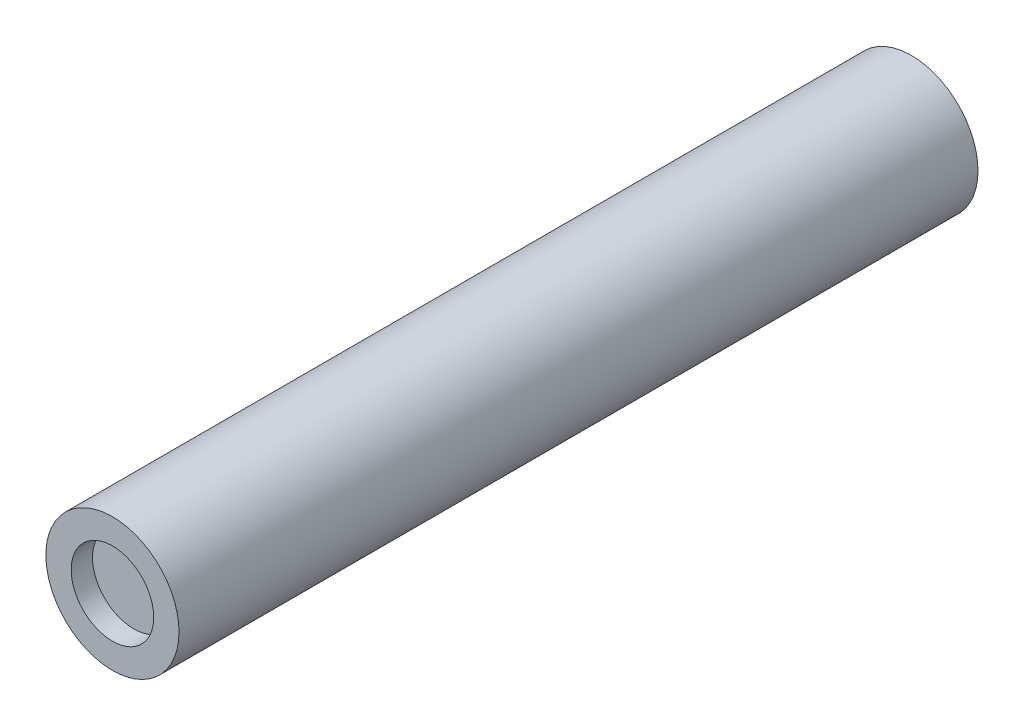
ISO-10303-21;
HEADER;
FILE_DESCRIPTION(('STEP AP214'),'2;1');
FILE_NAME('part.step','',(''),(''),'','','');
FILE_SCHEMA(('AUTOMOTIVE_DESIGN { 1 0 10303 214 1 1 1 1 }'));
ENDSEC;
DATA;
#1=APPLICATION_CONTEXT('core data for automotive mechanical design processes');
#2=APPLICATION_PROTOCOL_DEFINITION('international standard','automotive_design',2000,#1);
#3=PRODUCT_CONTEXT('',#1,'mechanical');
#4=PRODUCT('Part','Part','',(#3));
#5=PRODUCT_RELATED_PRODUCT_CATEGORY('part','',(#4));
#6=PRODUCT_DEFINITION_FORMATION('','',#4);
#7=PRODUCT_DEFINITION_CONTEXT('part definition',#1,'design');
#8=PRODUCT_DEFINITION('design','',#6,#7);
#9=PRODUCT_DEFINITION_SHAPE('','',#8);
#10=(LENGTH_UNIT() NAMED_UNIT(*) SI_UNIT(.MILLI.,.METRE.));
#11=(NAMED_UNIT(*) PLANE_ANGLE_UNIT() SI_UNIT($,.RADIAN.));
#12=(NAMED_UNIT(*) SI_UNIT($,.STERADIAN.) SOLID_ANGLE_UNIT());
#13=UNCERTAINTY_MEASURE_WITH_UNIT(LENGTH_MEASURE(1.E-05),#10,'distance_accuracy_value','');
#14=(GEOMETRIC_REPRESENTATION_CONTEXT(3) GLOBAL_UNCERTAINTY_ASSIGNED_CONTEXT((#13)) GLOBAL_UNIT_ASSIGNED_CONTEXT((#10,
#11,#12)) REPRESENTATION_CONTEXT('',''));
#15=CARTESIAN_POINT('',(0.,0.,0.));
#16=DIRECTION('',(0.,0.,1.));
#17=DIRECTION('',(1.,0.,0.));
#18=AXIS2_PLACEMENT_3D('',#15,#16,#17);
#19=CARTESIAN_POINT('',(-47.0621091602806,23.3146449704142,60.));
#20=DIRECTION('',(0.,0.,-1.));
#21=DIRECTION('',(-1.,0.,0.));
#22=AXIS2_PLACEMENT_3D('',#19,#20,#21);
#23=CYLINDRICAL_SURFACE('',#22,5.);
#24=CARTESIAN_POINT('',(-47.0621091602806,23.3146449704142,60.));
#25=DIRECTION('',(0.,0.,1.));
#26=DIRECTION('',(1.,0.,0.));
#27=AXIS2_PLACEMENT_3D('',#24,#25,#26);
#28=CIRCLE('',#27,5.);
#29=CARTESIAN_POINT('',(-42.0621091602806,23.3146449704142,60.));
#30=VERTEX_POINT('',#29);
#31=EDGE_CURVE('E10',#30,#30,#28,.T.);
#32=ORIENTED_EDGE('',*,*,#31,.F.);
#33=EDGE_LOOP('',(#32));
#34=FACE_BOUND('',#33,.T.);
#35=CARTESIAN_POINT('',(-47.0621091602806,23.3146449704142,0.));
#36=DIRECTION('',(0.,0.,1.));
#37=DIRECTION('',(1.,0.,0.));
#38=AXIS2_PLACEMENT_3D('',#35,#36,#37);
#39=CIRCLE('',#38,5.);
#40=CARTESIAN_POINT('',(-42.0621091602806,23.3146449704142,0.));
#41=VERTEX_POINT('',#40);
#42=EDGE_CURVE('E34',#41,#41,#39,.T.);
#43=ORIENTED_EDGE('',*,*,#42,.T.);
#44=EDGE_LOOP('',(#43));
#45=FACE_BOUND('',#44,.T.);
#46=ADVANCED_FACE('F31',(#34,#45),#23,.T.);
#47=CARTESIAN_POINT('',(-47.0621091602806,23.3146449704142,60.));
#48=DIRECTION('',(0.,0.,1.));
#49=DIRECTION('',(1.,0.,0.));
#50=AXIS2_PLACEMENT_3D('',#47,#48,#49);
#51=PLANE('',#50);
#52=CARTESIAN_POINT('',(-47.0621091602806,23.3146449704142,60.));
#53=DIRECTION('',(0.,0.,1.));
#54=DIRECTION('',(1.,0.,0.));
#55=AXIS2_PLACEMENT_3D('',#52,#53,#54);
#56=CIRCLE('',#55,3.1);
#57=CARTESIAN_POINT('',(-43.9621091602806,23.3146449704142,60.));
#58=VERTEX_POINT('',#57);
#59=EDGE_CURVE('E43',#58,#58,#56,.T.);
#60=ORIENTED_EDGE('',*,*,#59,.F.);
#61=EDGE_LOOP('',(#60));
#62=FACE_BOUND('',#61,.T.);
#63=ORIENTED_EDGE('',*,*,#31,.T.);
#64=EDGE_LOOP('',(#63));
#65=FACE_BOUND('',#64,.T.);
#66=ADVANCED_FACE('F68',(#62,#65),#51,.T.);
#67=CARTESIAN_POINT('',(-47.0621091602806,23.3146449704142,0.));
#68=DIRECTION('',(0.,0.,1.));
#69=DIRECTION('',(1.,0.,0.));
#70=AXIS2_PLACEMENT_3D('',#67,#68,#69);
#71=PLANE('',#70);
#72=CARTESIAN_POINT('',(-47.0621091602806,23.3146449704142,0.));
#73=DIRECTION('',(0.,0.,-1.));
#74=DIRECTION('',(-1.,0.,0.));
#75=AXIS2_PLACEMENT_3D('',#72,#73,#74);
#76=CIRCLE('',#75,3.1);
#77=CARTESIAN_POINT('',(-50.1621091602806,23.3146449704142,0.));
#78=VERTEX_POINT('',#77);
#79=EDGE_CURVE('E49',#78,#78,#76,.T.);
#80=ORIENTED_EDGE('',*,*,#79,.F.);
#81=EDGE_LOOP('',(#80));
#82=FACE_BOUND('',#81,.T.);
#83=ORIENTED_EDGE('',*,*,#42,.F.);
#84=EDGE_LOOP('',(#83));
#85=FACE_BOUND('',#84,.T.);
#86=ADVANCED_FACE('F64',(#82,#85),#71,.F.);
#87=CARTESIAN_POINT('',(-47.0621091602806,23.3146449704142,58.4));
#88=DIRECTION('',(0.,0.,1.));
#89=DIRECTION('',(1.,0.,0.));
#90=AXIS2_PLACEMENT_3D('',#87,#88,#89);
#91=CYLINDRICAL_SURFACE('',#90,3.1);
#92=CARTESIAN_POINT('',(-47.0621091602806,23.3146449704142,58.4));
#93=DIRECTION('',(0.,0.,1.));
#94=DIRECTION('',(1.,0.,0.));
#95=AXIS2_PLACEMENT_3D('',#92,#93,#94);
#96=CIRCLE('',#95,3.1);
#97=CARTESIAN_POINT('',(-43.9621091602806,23.3146449704142,58.4));
#98=VERTEX_POINT('',#97);
#99=EDGE_CURVE('E41',#98,#98,#96,.T.);
#100=ORIENTED_EDGE('',*,*,#99,.F.);
#101=EDGE_LOOP('',(#100));
#102=FACE_BOUND('',#101,.T.);
#103=ORIENTED_EDGE('',*,*,#59,.T.);
#104=EDGE_LOOP('',(#103));
#105=FACE_BOUND('',#104,.T.);
#106=ADVANCED_FACE('F67',(#102,#105),#91,.F.);
#107=CARTESIAN_POINT('',(-47.0621091602806,23.3146449704142,58.4));
#108=DIRECTION('',(0.,0.,1.));
#109=DIRECTION('',(1.,0.,0.));
#110=AXIS2_PLACEMENT_3D('',#107,#108,#109);
#111=PLANE('',#110);
#112=ORIENTED_EDGE('',*,*,#99,.T.);
#113=EDGE_LOOP('',(#112));
#114=FACE_BOUND('',#113,.T.);
#115=ADVANCED_FACE('F60',(#114),#111,.T.);
#116=CARTESIAN_POINT('',(-47.0621091602806,23.3146449704142,1.6));
#117=DIRECTION('',(0.,0.,-1.));
#118=DIRECTION('',(-1.,0.,0.));
#119=AXIS2_PLACEMENT_3D('',#116,#117,#118);
#120=CYLINDRICAL_SURFACE('',#119,3.1);
#121=CARTESIAN_POINT('',(-47.0621091602806,23.3146449704142,1.6));
#122=DIRECTION('',(0.,0.,-1.));
#123=DIRECTION('',(-1.,0.,0.));
#124=AXIS2_PLACEMENT_3D('',#121,#122,#123);
#125=CIRCLE('',#124,3.1);
#126=CARTESIAN_POINT('',(-50.1621091602806,23.3146449704142,1.6));
#127=VERTEX_POINT('',#126);
#128=EDGE_CURVE('E46',#127,#127,#125,.T.);
#129=ORIENTED_EDGE('',*,*,#128,.F.);
#130=EDGE_LOOP('',(#129));
#131=FACE_BOUND('',#130,.T.);
#132=ORIENTED_EDGE('',*,*,#79,.T.);
#133=EDGE_LOOP('',(#132));
#134=FACE_BOUND('',#133,.T.);
#135=ADVANCED_FACE('F57',(#131,#134),#120,.F.);
#136=CARTESIAN_POINT('',(-47.0621091602806,23.3146449704142,1.6));
#137=DIRECTION('',(0.,0.,-1.));
#138=DIRECTION('',(-1.,0.,0.));
#139=AXIS2_PLACEMENT_3D('',#136,#137,#138);
#140=PLANE('',#139);
#141=ORIENTED_EDGE('',*,*,#128,.T.);
#142=EDGE_LOOP('',(#141));
#143=FACE_BOUND('',#142,.T.);
#144=ADVANCED_FACE('F55',(#143),#140,.T.);
#145=CLOSED_SHELL('',(#46,#66,#86,#106,#115,#135,#144));
#146=MANIFOLD_SOLID_BREP('B2',#145);
#147=ADVANCED_BREP_SHAPE_REPRESENTATION('',(#18,#146),#14);
#148=SHAPE_DEFINITION_REPRESENTATION(#9,#147);
ENDSEC;
END-ISO-10303-21;
